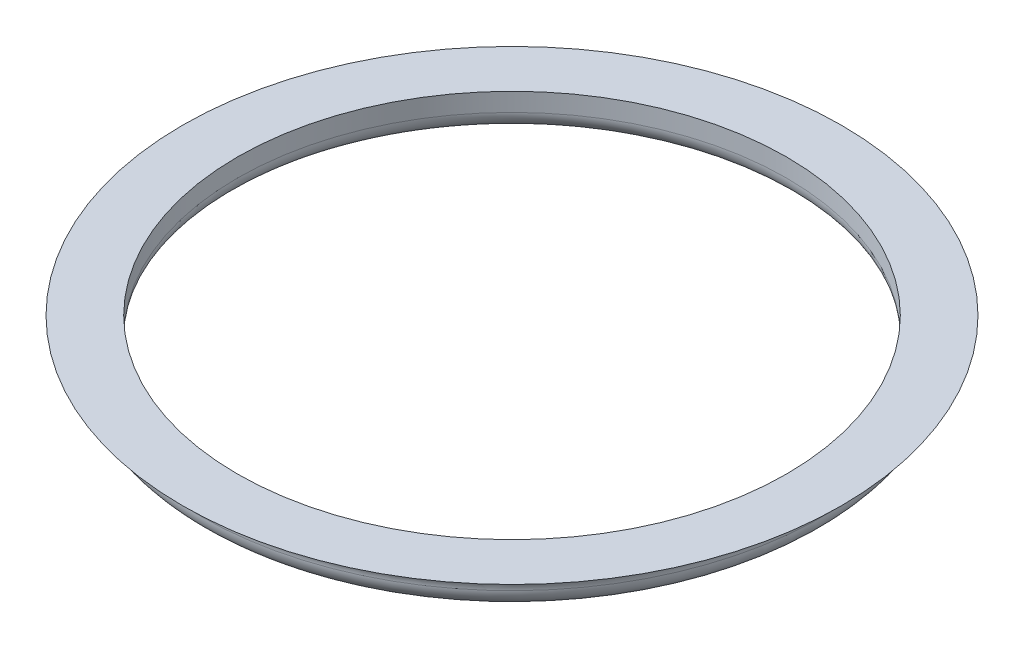
ISO-10303-21;
HEADER;
FILE_DESCRIPTION(('STEP AP214'),'2;1');
FILE_NAME('part.step','',(''),(''),'','','');
FILE_SCHEMA(('AUTOMOTIVE_DESIGN { 1 0 10303 214 1 1 1 1 }'));
ENDSEC;
DATA;
#1=APPLICATION_CONTEXT('core data for automotive mechanical design processes');
#2=APPLICATION_PROTOCOL_DEFINITION('international standard','automotive_design',2000,#1);
#3=PRODUCT_CONTEXT('',#1,'mechanical');
#4=PRODUCT('Part','Part','',(#3));
#5=PRODUCT_RELATED_PRODUCT_CATEGORY('part','',(#4));
#6=PRODUCT_DEFINITION_FORMATION('','',#4);
#7=PRODUCT_DEFINITION_CONTEXT('part definition',#1,'design');
#8=PRODUCT_DEFINITION('design','',#6,#7);
#9=PRODUCT_DEFINITION_SHAPE('','',#8);
#10=(LENGTH_UNIT() NAMED_UNIT(*) SI_UNIT(.MILLI.,.METRE.));
#11=(NAMED_UNIT(*) PLANE_ANGLE_UNIT() SI_UNIT($,.RADIAN.));
#12=(NAMED_UNIT(*) SI_UNIT($,.STERADIAN.) SOLID_ANGLE_UNIT());
#13=UNCERTAINTY_MEASURE_WITH_UNIT(LENGTH_MEASURE(1.E-05),#10,'distance_accuracy_value','');
#14=(GEOMETRIC_REPRESENTATION_CONTEXT(3) GLOBAL_UNCERTAINTY_ASSIGNED_CONTEXT((#13)) GLOBAL_UNIT_ASSIGNED_CONTEXT((#10,
#11,#12)) REPRESENTATION_CONTEXT('',''));
#15=CARTESIAN_POINT('',(0.,0.,0.));
#16=DIRECTION('',(0.,0.,1.));
#17=DIRECTION('',(1.,0.,0.));
#18=AXIS2_PLACEMENT_3D('',#15,#16,#17);
#19=CARTESIAN_POINT('',(51.1,0.,-86.5));
#20=DIRECTION('',(0.,-1.,0.));
#21=DIRECTION('',(0.,0.,-1.));
#22=AXIS2_PLACEMENT_3D('',#19,#20,#21);
#23=PLANE('',#22);
#24=CARTESIAN_POINT('',(32.05,0.,-51.3545058824818));
#25=DIRECTION('',(0.,1.,0.));
#26=DIRECTION('',(0.,0.,1.));
#27=AXIS2_PLACEMENT_3D('',#24,#25,#26);
#28=CIRCLE('',#27,27.);
#29=CARTESIAN_POINT('',(32.05,0.,-24.3545058824818));
#30=VERTEX_POINT('',#29);
#31=EDGE_CURVE('E56',#30,#30,#28,.T.);
#32=ORIENTED_EDGE('',*,*,#31,.T.);
#33=EDGE_LOOP('',(#32));
#34=FACE_BOUND('',#33,.T.);
#35=CARTESIAN_POINT('',(32.05,0.,-51.3545058824818));
#36=DIRECTION('',(0.,-1.,0.));
#37=DIRECTION('',(0.,0.,-1.));
#38=AXIS2_PLACEMENT_3D('',#35,#36,#37);
#39=CIRCLE('',#38,22.5);
#40=CARTESIAN_POINT('',(32.05,0.,-73.8545058824818));
#41=VERTEX_POINT('',#40);
#42=EDGE_CURVE('E43',#41,#41,#39,.F.);
#43=ORIENTED_EDGE('',*,*,#42,.F.);
#44=EDGE_LOOP('',(#43));
#45=FACE_BOUND('',#44,.T.);
#46=ADVANCED_FACE('F39',(#34,#45),#23,.F.);
#47=CARTESIAN_POINT('',(32.05,-1.5,-51.3545058824818));
#48=DIRECTION('',(0.,-1.,0.));
#49=DIRECTION('',(0.,0.,-1.));
#50=AXIS2_PLACEMENT_3D('',#47,#48,#49);
#51=TOROIDAL_SURFACE('',#50,24.,1.5);
#52=CARTESIAN_POINT('',(32.05,-1.5,-51.3545058824818));
#53=DIRECTION('',(0.,-1.,0.));
#54=DIRECTION('',(0.,0.,-1.));
#55=AXIS2_PLACEMENT_3D('',#52,#53,#54);
#56=CIRCLE('',#55,22.5);
#57=CARTESIAN_POINT('',(32.05,-1.5,-73.8545058824818));
#58=VERTEX_POINT('',#57);
#59=EDGE_CURVE('E52',#58,#58,#56,.T.);
#60=ORIENTED_EDGE('',*,*,#59,.F.);
#61=EDGE_LOOP('',(#60));
#62=FACE_BOUND('',#61,.T.);
#63=CARTESIAN_POINT('',(32.05,-3.,-51.3545058824818));
#64=DIRECTION('',(0.,-1.,0.));
#65=DIRECTION('',(0.,0.,-1.));
#66=AXIS2_PLACEMENT_3D('',#63,#64,#65);
#67=CIRCLE('',#66,24.);
#68=CARTESIAN_POINT('',(32.05,-3.,-75.3545058824818));
#69=VERTEX_POINT('',#68);
#70=EDGE_CURVE('E10',#69,#69,#67,.F.);
#71=ORIENTED_EDGE('',*,*,#70,.F.);
#72=EDGE_LOOP('',(#71));
#73=FACE_BOUND('',#72,.T.);
#74=ADVANCED_FACE('F66',(#62,#73),#51,.T.);
#75=CARTESIAN_POINT('',(32.05,10.,-51.3545058824818));
#76=DIRECTION('',(0.,-1.,0.));
#77=DIRECTION('',(0.,0.,-1.));
#78=AXIS2_PLACEMENT_3D('',#75,#76,#77);
#79=CYLINDRICAL_SURFACE('',#78,22.5);
#80=ORIENTED_EDGE('',*,*,#42,.T.);
#81=EDGE_LOOP('',(#80));
#82=FACE_BOUND('',#81,.T.);
#83=ORIENTED_EDGE('',*,*,#59,.T.);
#84=EDGE_LOOP('',(#83));
#85=FACE_BOUND('',#84,.T.);
#86=ADVANCED_FACE('F41',(#82,#85),#79,.F.);
#87=CARTESIAN_POINT('',(32.05,-1.5,-51.3545058824818));
#88=DIRECTION('',(0.,-1.,0.));
#89=DIRECTION('',(0.,0.,-1.));
#90=AXIS2_PLACEMENT_3D('',#87,#88,#89);
#91=TOROIDAL_SURFACE('',#90,24.,1.5);
#92=CARTESIAN_POINT('',(32.05,-1.5,-51.3545058824818));
#93=DIRECTION('',(0.,1.,0.));
#94=DIRECTION('',(0.,0.,1.));
#95=AXIS2_PLACEMENT_3D('',#92,#93,#94);
#96=CIRCLE('',#95,25.5);
#97=CARTESIAN_POINT('',(32.05,-1.5,-25.8545058824818));
#98=VERTEX_POINT('',#97);
#99=EDGE_CURVE('E47',#98,#98,#96,.F.);
#100=ORIENTED_EDGE('',*,*,#99,.T.);
#101=EDGE_LOOP('',(#100));
#102=FACE_BOUND('',#101,.T.);
#103=ORIENTED_EDGE('',*,*,#70,.T.);
#104=EDGE_LOOP('',(#103));
#105=FACE_BOUND('',#104,.T.);
#106=ADVANCED_FACE('F73',(#102,#105),#91,.T.);
#107=CARTESIAN_POINT('',(32.05,-1.5,-51.3545058824818));
#108=DIRECTION('',(0.,1.,0.));
#109=DIRECTION('',(0.,0.,1.));
#110=AXIS2_PLACEMENT_3D('',#107,#108,#109);
#111=TOROIDAL_SURFACE('',#110,27.,1.5);
#112=ORIENTED_EDGE('',*,*,#31,.F.);
#113=EDGE_LOOP('',(#112));
#114=FACE_BOUND('',#113,.T.);
#115=ORIENTED_EDGE('',*,*,#99,.F.);
#116=EDGE_LOOP('',(#115));
#117=FACE_BOUND('',#116,.T.);
#118=ADVANCED_FACE('F75',(#114,#117),#111,.F.);
#119=CLOSED_SHELL('',(#46,#74,#86,#106,#118));
#120=MANIFOLD_SOLID_BREP('B2',#119);
#121=ADVANCED_BREP_SHAPE_REPRESENTATION('',(#18,#120),#14);
#122=SHAPE_DEFINITION_REPRESENTATION(#9,#121);
ENDSEC;
END-ISO-10303-21;
